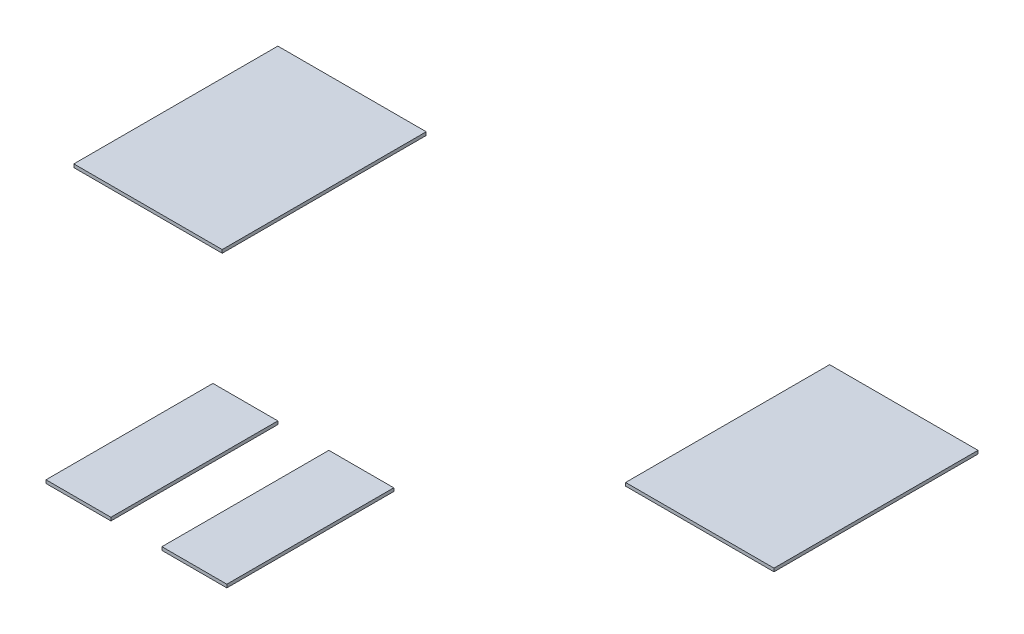
ISO-10303-21;
HEADER;
FILE_DESCRIPTION(('STEP AP214'),'2;1');
FILE_NAME('part.step','',(''),(''),'','','');
FILE_SCHEMA(('AUTOMOTIVE_DESIGN { 1 0 10303 214 1 1 1 1 }'));
ENDSEC;
DATA;
#1=APPLICATION_CONTEXT('core data for automotive mechanical design processes');
#2=APPLICATION_PROTOCOL_DEFINITION('international standard','automotive_design',2000,#1);
#3=PRODUCT_CONTEXT('',#1,'mechanical');
#4=PRODUCT('Part','Part','',(#3));
#5=PRODUCT_RELATED_PRODUCT_CATEGORY('part','',(#4));
#6=PRODUCT_DEFINITION_FORMATION('','',#4);
#7=PRODUCT_DEFINITION_CONTEXT('part definition',#1,'design');
#8=PRODUCT_DEFINITION('design','',#6,#7);
#9=PRODUCT_DEFINITION_SHAPE('','',#8);
#10=(LENGTH_UNIT() NAMED_UNIT(*) SI_UNIT(.MILLI.,.METRE.));
#11=(NAMED_UNIT(*) PLANE_ANGLE_UNIT() SI_UNIT($,.RADIAN.));
#12=(NAMED_UNIT(*) SI_UNIT($,.STERADIAN.) SOLID_ANGLE_UNIT());
#13=UNCERTAINTY_MEASURE_WITH_UNIT(LENGTH_MEASURE(1.E-05),#10,'distance_accuracy_value','');
#14=(GEOMETRIC_REPRESENTATION_CONTEXT(3) GLOBAL_UNCERTAINTY_ASSIGNED_CONTEXT((#13)) GLOBAL_UNIT_ASSIGNED_CONTEXT((#10,
#11,#12)) REPRESENTATION_CONTEXT('',''));
#15=CARTESIAN_POINT('',(0.,0.,0.));
#16=DIRECTION('',(0.,0.,1.));
#17=DIRECTION('',(1.,0.,0.));
#18=AXIS2_PLACEMENT_3D('',#15,#16,#17);
#19=CARTESIAN_POINT('',(-2.175,0.035,-5.3));
#20=DIRECTION('',(-1.,0.,0.));
#21=DIRECTION('',(0.,0.,1.));
#22=AXIS2_PLACEMENT_3D('',#19,#20,#21);
#23=PLANE('',#22);
#24=DIRECTION('',(0.,0.,-1.));
#25=VECTOR('',#24,1.);
#26=CARTESIAN_POINT('',(-2.175,0.,-5.3));
#27=LINE('',#26,#25);
#28=CARTESIAN_POINT('',(-2.175,0.,-3.1));
#29=VERTEX_POINT('',#28);
#30=CARTESIAN_POINT('',(-2.175,0.,-5.3));
#31=VERTEX_POINT('',#30);
#32=EDGE_CURVE('E106',#29,#31,#27,.T.);
#33=ORIENTED_EDGE('',*,*,#32,.T.);
#34=DIRECTION('',(0.,-1.,0.));
#35=VECTOR('',#34,1.);
#36=CARTESIAN_POINT('',(-2.175,0.035,-5.3));
#37=LINE('',#36,#35);
#38=CARTESIAN_POINT('',(-2.175,0.035,-5.3));
#39=VERTEX_POINT('',#38);
#40=EDGE_CURVE('E12',#39,#31,#37,.T.);
#41=ORIENTED_EDGE('',*,*,#40,.F.);
#42=DIRECTION('',(0.,0.,-1.));
#43=VECTOR('',#42,1.);
#44=CARTESIAN_POINT('',(-2.175,0.035,-5.3));
#45=LINE('',#44,#43);
#46=CARTESIAN_POINT('',(-2.175,0.035,-3.1));
#47=VERTEX_POINT('',#46);
#48=EDGE_CURVE('E94',#47,#39,#45,.T.);
#49=ORIENTED_EDGE('',*,*,#48,.F.);
#50=DIRECTION('',(0.,-1.,0.));
#51=VECTOR('',#50,1.);
#52=CARTESIAN_POINT('',(-2.175,0.035,-3.1));
#53=LINE('',#52,#51);
#54=EDGE_CURVE('E102',#47,#29,#53,.T.);
#55=ORIENTED_EDGE('',*,*,#54,.T.);
#56=EDGE_LOOP('',(#33,#41,#49,#55));
#57=FACE_BOUND('',#56,.T.);
#58=ADVANCED_FACE('F43',(#57),#23,.F.);
#59=CARTESIAN_POINT('',(-2.175,0.035,-5.3));
#60=DIRECTION('',(0.,0.,1.));
#61=DIRECTION('',(1.,0.,0.));
#62=AXIS2_PLACEMENT_3D('',#59,#60,#61);
#63=PLANE('',#62);
#64=DIRECTION('',(-1.,0.,0.));
#65=VECTOR('',#64,1.);
#66=CARTESIAN_POINT('',(-2.175,0.,-5.3));
#67=LINE('',#66,#65);
#68=CARTESIAN_POINT('',(-3.775,0.,-5.3));
#69=VERTEX_POINT('',#68);
#70=EDGE_CURVE('E98',#31,#69,#67,.T.);
#71=ORIENTED_EDGE('',*,*,#70,.T.);
#72=DIRECTION('',(0.,-1.,0.));
#73=VECTOR('',#72,1.);
#74=CARTESIAN_POINT('',(-3.775,0.035,-5.3));
#75=LINE('',#74,#73);
#76=CARTESIAN_POINT('',(-3.775,0.035,-5.3));
#77=VERTEX_POINT('',#76);
#78=EDGE_CURVE('E51',#77,#69,#75,.T.);
#79=ORIENTED_EDGE('',*,*,#78,.F.);
#80=DIRECTION('',(-1.,0.,0.));
#81=VECTOR('',#80,1.);
#82=CARTESIAN_POINT('',(-2.175,0.035,-5.3));
#83=LINE('',#82,#81);
#84=EDGE_CURVE('E89',#39,#77,#83,.T.);
#85=ORIENTED_EDGE('',*,*,#84,.F.);
#86=ORIENTED_EDGE('',*,*,#40,.T.);
#87=EDGE_LOOP('',(#71,#79,#85,#86));
#88=FACE_BOUND('',#87,.T.);
#89=ADVANCED_FACE('F97',(#88),#63,.F.);
#90=CARTESIAN_POINT('',(-3.775,0.035,-5.3));
#91=DIRECTION('',(1.,0.,0.));
#92=DIRECTION('',(0.,0.,-1.));
#93=AXIS2_PLACEMENT_3D('',#90,#91,#92);
#94=PLANE('',#93);
#95=DIRECTION('',(0.,0.,1.));
#96=VECTOR('',#95,1.);
#97=CARTESIAN_POINT('',(-3.775,0.,-5.3));
#98=LINE('',#97,#96);
#99=CARTESIAN_POINT('',(-3.775,0.,-3.1));
#100=VERTEX_POINT('',#99);
#101=EDGE_CURVE('E76',#69,#100,#98,.T.);
#102=ORIENTED_EDGE('',*,*,#101,.T.);
#103=DIRECTION('',(0.,-1.,0.));
#104=VECTOR('',#103,1.);
#105=CARTESIAN_POINT('',(-3.775,0.035,-3.1));
#106=LINE('',#105,#104);
#107=CARTESIAN_POINT('',(-3.775,0.035,-3.1));
#108=VERTEX_POINT('',#107);
#109=EDGE_CURVE('E99',#108,#100,#106,.T.);
#110=ORIENTED_EDGE('',*,*,#109,.F.);
#111=DIRECTION('',(0.,0.,1.));
#112=VECTOR('',#111,1.);
#113=CARTESIAN_POINT('',(-3.775,0.035,-5.3));
#114=LINE('',#113,#112);
#115=EDGE_CURVE('E92',#77,#108,#114,.T.);
#116=ORIENTED_EDGE('',*,*,#115,.F.);
#117=ORIENTED_EDGE('',*,*,#78,.T.);
#118=EDGE_LOOP('',(#102,#110,#116,#117));
#119=FACE_BOUND('',#118,.T.);
#120=ADVANCED_FACE('F100',(#119),#94,.F.);
#121=CARTESIAN_POINT('',(-2.175,0.035,-3.1));
#122=DIRECTION('',(0.,0.,-1.));
#123=DIRECTION('',(-1.,0.,0.));
#124=AXIS2_PLACEMENT_3D('',#121,#122,#123);
#125=PLANE('',#124);
#126=DIRECTION('',(1.,0.,0.));
#127=VECTOR('',#126,1.);
#128=CARTESIAN_POINT('',(-2.175,0.,-3.1));
#129=LINE('',#128,#127);
#130=EDGE_CURVE('E82',#100,#29,#129,.T.);
#131=ORIENTED_EDGE('',*,*,#130,.T.);
#132=ORIENTED_EDGE('',*,*,#54,.F.);
#133=DIRECTION('',(1.,0.,0.));
#134=VECTOR('',#133,1.);
#135=CARTESIAN_POINT('',(-2.175,0.035,-3.1));
#136=LINE('',#135,#134);
#137=EDGE_CURVE('E59',#108,#47,#136,.T.);
#138=ORIENTED_EDGE('',*,*,#137,.F.);
#139=ORIENTED_EDGE('',*,*,#109,.T.);
#140=EDGE_LOOP('',(#131,#132,#138,#139));
#141=FACE_BOUND('',#140,.T.);
#142=ADVANCED_FACE('F113',(#141),#125,.F.);
#143=CARTESIAN_POINT('',(0.,0.035,0.));
#144=DIRECTION('',(0.,-1.,0.));
#145=DIRECTION('',(0.,0.,-1.));
#146=AXIS2_PLACEMENT_3D('',#143,#144,#145);
#147=PLANE('',#146);
#148=ORIENTED_EDGE('',*,*,#48,.T.);
#149=ORIENTED_EDGE('',*,*,#84,.T.);
#150=ORIENTED_EDGE('',*,*,#115,.T.);
#151=ORIENTED_EDGE('',*,*,#137,.T.);
#152=EDGE_LOOP('',(#148,#149,#150,#151));
#153=FACE_BOUND('',#152,.T.);
#154=ADVANCED_FACE('F90',(#153),#147,.F.);
#155=CARTESIAN_POINT('',(0.,0.,0.));
#156=DIRECTION('',(0.,-1.,0.));
#157=DIRECTION('',(0.,0.,-1.));
#158=AXIS2_PLACEMENT_3D('',#155,#156,#157);
#159=PLANE('',#158);
#160=ORIENTED_EDGE('',*,*,#32,.F.);
#161=ORIENTED_EDGE('',*,*,#130,.F.);
#162=ORIENTED_EDGE('',*,*,#101,.F.);
#163=ORIENTED_EDGE('',*,*,#70,.F.);
#164=EDGE_LOOP('',(#160,#161,#162,#163));
#165=FACE_BOUND('',#164,.T.);
#166=ADVANCED_FACE('F116',(#165),#159,.T.);
#167=CLOSED_SHELL('',(#58,#89,#120,#142,#154,#166));
#168=MANIFOLD_SOLID_BREP('B2',#167);
#169=CARTESIAN_POINT('',(-0.275,0.035,0.));
#170=DIRECTION('',(-1.,0.,0.));
#171=DIRECTION('',(0.,0.,1.));
#172=AXIS2_PLACEMENT_3D('',#169,#170,#171);
#173=PLANE('',#172);
#174=DIRECTION('',(0.,0.,-1.));
#175=VECTOR('',#174,1.);
#176=CARTESIAN_POINT('',(-0.275,0.,0.));
#177=LINE('',#176,#175);
#178=CARTESIAN_POINT('',(-0.275,0.,0.));
#179=VERTEX_POINT('',#178);
#180=CARTESIAN_POINT('',(-0.275,0.,-1.8));
#181=VERTEX_POINT('',#180);
#182=EDGE_CURVE('E239',#179,#181,#177,.T.);
#183=ORIENTED_EDGE('',*,*,#182,.T.);
#184=DIRECTION('',(0.,-1.,0.));
#185=VECTOR('',#184,1.);
#186=CARTESIAN_POINT('',(-0.275,0.035,-1.8));
#187=LINE('',#186,#185);
#188=CARTESIAN_POINT('',(-0.275,0.035,-1.8));
#189=VERTEX_POINT('',#188);
#190=EDGE_CURVE('E41',#189,#181,#187,.T.);
#191=ORIENTED_EDGE('',*,*,#190,.F.);
#192=DIRECTION('',(0.,0.,-1.));
#193=VECTOR('',#192,1.);
#194=CARTESIAN_POINT('',(-0.275,0.035,0.));
#195=LINE('',#194,#193);
#196=CARTESIAN_POINT('',(-0.275,0.035,0.));
#197=VERTEX_POINT('',#196);
#198=EDGE_CURVE('E227',#197,#189,#195,.T.);
#199=ORIENTED_EDGE('',*,*,#198,.F.);
#200=DIRECTION('',(0.,-1.,0.));
#201=VECTOR('',#200,1.);
#202=CARTESIAN_POINT('',(-0.275,0.035,0.));
#203=LINE('',#202,#201);
#204=EDGE_CURVE('E235',#197,#179,#203,.T.);
#205=ORIENTED_EDGE('',*,*,#204,.T.);
#206=EDGE_LOOP('',(#183,#191,#199,#205));
#207=FACE_BOUND('',#206,.T.);
#208=ADVANCED_FACE('F176',(#207),#173,.F.);
#209=CARTESIAN_POINT('',(-0.275,0.035,-1.8));
#210=DIRECTION('',(0.,0.,1.));
#211=DIRECTION('',(1.,0.,0.));
#212=AXIS2_PLACEMENT_3D('',#209,#210,#211);
#213=PLANE('',#212);
#214=DIRECTION('',(-1.,0.,0.));
#215=VECTOR('',#214,1.);
#216=CARTESIAN_POINT('',(-0.275,0.,-1.8));
#217=LINE('',#216,#215);
#218=CARTESIAN_POINT('',(-0.974999999999999,0.,-1.8));
#219=VERTEX_POINT('',#218);
#220=EDGE_CURVE('E231',#181,#219,#217,.T.);
#221=ORIENTED_EDGE('',*,*,#220,.T.);
#222=DIRECTION('',(0.,-1.,0.));
#223=VECTOR('',#222,1.);
#224=CARTESIAN_POINT('',(-0.974999999999999,0.035,-1.8));
#225=LINE('',#224,#223);
#226=CARTESIAN_POINT('',(-0.974999999999999,0.035,-1.8));
#227=VERTEX_POINT('',#226);
#228=EDGE_CURVE('E184',#227,#219,#225,.T.);
#229=ORIENTED_EDGE('',*,*,#228,.F.);
#230=DIRECTION('',(-1.,0.,0.));
#231=VECTOR('',#230,1.);
#232=CARTESIAN_POINT('',(-0.275,0.035,-1.8));
#233=LINE('',#232,#231);
#234=EDGE_CURVE('E222',#189,#227,#233,.T.);
#235=ORIENTED_EDGE('',*,*,#234,.F.);
#236=ORIENTED_EDGE('',*,*,#190,.T.);
#237=EDGE_LOOP('',(#221,#229,#235,#236));
#238=FACE_BOUND('',#237,.T.);
#239=ADVANCED_FACE('F230',(#238),#213,.F.);
#240=CARTESIAN_POINT('',(-0.975,0.035,0.));
#241=DIRECTION('',(1.,0.,0.));
#242=DIRECTION('',(0.,0.,-1.));
#243=AXIS2_PLACEMENT_3D('',#240,#241,#242);
#244=PLANE('',#243);
#245=DIRECTION('',(0.,0.,1.));
#246=VECTOR('',#245,1.);
#247=CARTESIAN_POINT('',(-0.975,0.,0.));
#248=LINE('',#247,#246);
#249=CARTESIAN_POINT('',(-0.975,0.,0.));
#250=VERTEX_POINT('',#249);
#251=EDGE_CURVE('E209',#219,#250,#248,.T.);
#252=ORIENTED_EDGE('',*,*,#251,.T.);
#253=DIRECTION('',(0.,-1.,0.));
#254=VECTOR('',#253,1.);
#255=CARTESIAN_POINT('',(-0.975,0.035,0.));
#256=LINE('',#255,#254);
#257=CARTESIAN_POINT('',(-0.975,0.035,0.));
#258=VERTEX_POINT('',#257);
#259=EDGE_CURVE('E232',#258,#250,#256,.T.);
#260=ORIENTED_EDGE('',*,*,#259,.F.);
#261=DIRECTION('',(0.,0.,1.));
#262=VECTOR('',#261,1.);
#263=CARTESIAN_POINT('',(-0.975,0.035,0.));
#264=LINE('',#263,#262);
#265=EDGE_CURVE('E225',#227,#258,#264,.T.);
#266=ORIENTED_EDGE('',*,*,#265,.F.);
#267=ORIENTED_EDGE('',*,*,#228,.T.);
#268=EDGE_LOOP('',(#252,#260,#266,#267));
#269=FACE_BOUND('',#268,.T.);
#270=ADVANCED_FACE('F233',(#269),#244,.F.);
#271=CARTESIAN_POINT('',(-0.275,0.035,0.));
#272=DIRECTION('',(0.,0.,-1.));
#273=DIRECTION('',(-1.,0.,0.));
#274=AXIS2_PLACEMENT_3D('',#271,#272,#273);
#275=PLANE('',#274);
#276=DIRECTION('',(1.,0.,0.));
#277=VECTOR('',#276,1.);
#278=CARTESIAN_POINT('',(-0.275,0.,0.));
#279=LINE('',#278,#277);
#280=EDGE_CURVE('E215',#250,#179,#279,.T.);
#281=ORIENTED_EDGE('',*,*,#280,.T.);
#282=ORIENTED_EDGE('',*,*,#204,.F.);
#283=DIRECTION('',(1.,0.,0.));
#284=VECTOR('',#283,1.);
#285=CARTESIAN_POINT('',(-0.275,0.035,0.));
#286=LINE('',#285,#284);
#287=EDGE_CURVE('E192',#258,#197,#286,.T.);
#288=ORIENTED_EDGE('',*,*,#287,.F.);
#289=ORIENTED_EDGE('',*,*,#259,.T.);
#290=EDGE_LOOP('',(#281,#282,#288,#289));
#291=FACE_BOUND('',#290,.T.);
#292=ADVANCED_FACE('F246',(#291),#275,.F.);
#293=CARTESIAN_POINT('',(0.,0.035,0.));
#294=DIRECTION('',(0.,1.,0.));
#295=DIRECTION('',(0.,0.,1.));
#296=AXIS2_PLACEMENT_3D('',#293,#294,#295);
#297=PLANE('',#296);
#298=ORIENTED_EDGE('',*,*,#198,.T.);
#299=ORIENTED_EDGE('',*,*,#234,.T.);
#300=ORIENTED_EDGE('',*,*,#265,.T.);
#301=ORIENTED_EDGE('',*,*,#287,.T.);
#302=EDGE_LOOP('',(#298,#299,#300,#301));
#303=FACE_BOUND('',#302,.T.);
#304=ADVANCED_FACE('F223',(#303),#297,.T.);
#305=CARTESIAN_POINT('',(0.,0.,0.));
#306=DIRECTION('',(0.,1.,0.));
#307=DIRECTION('',(0.,0.,1.));
#308=AXIS2_PLACEMENT_3D('',#305,#306,#307);
#309=PLANE('',#308);
#310=ORIENTED_EDGE('',*,*,#182,.F.);
#311=ORIENTED_EDGE('',*,*,#280,.F.);
#312=ORIENTED_EDGE('',*,*,#251,.F.);
#313=ORIENTED_EDGE('',*,*,#220,.F.);
#314=EDGE_LOOP('',(#310,#311,#312,#313));
#315=FACE_BOUND('',#314,.T.);
#316=ADVANCED_FACE('F249',(#315),#309,.F.);
#317=CLOSED_SHELL('',(#208,#239,#270,#292,#304,#316));
#318=MANIFOLD_SOLID_BREP('B6',#317);
#319=CARTESIAN_POINT('',(2.175,0.035,-5.3));
#320=DIRECTION('',(1.,0.,0.));
#321=DIRECTION('',(0.,0.,-1.));
#322=AXIS2_PLACEMENT_3D('',#319,#320,#321);
#323=PLANE('',#322);
#324=DIRECTION('',(0.,0.,1.));
#325=VECTOR('',#324,1.);
#326=CARTESIAN_POINT('',(2.175,0.,-5.3));
#327=LINE('',#326,#325);
#328=CARTESIAN_POINT('',(2.175,0.,-5.3));
#329=VERTEX_POINT('',#328);
#330=CARTESIAN_POINT('',(2.175,0.,-3.1));
#331=VERTEX_POINT('',#330);
#332=EDGE_CURVE('E371',#329,#331,#327,.T.);
#333=ORIENTED_EDGE('',*,*,#332,.T.);
#334=DIRECTION('',(0.,-1.,0.));
#335=VECTOR('',#334,1.);
#336=CARTESIAN_POINT('',(2.175,0.035,-3.1));
#337=LINE('',#336,#335);
#338=CARTESIAN_POINT('',(2.175,0.035,-3.1));
#339=VERTEX_POINT('',#338);
#340=EDGE_CURVE('E174',#339,#331,#337,.T.);
#341=ORIENTED_EDGE('',*,*,#340,.F.);
#342=DIRECTION('',(0.,0.,1.));
#343=VECTOR('',#342,1.);
#344=CARTESIAN_POINT('',(2.175,0.035,-5.3));
#345=LINE('',#344,#343);
#346=CARTESIAN_POINT('',(2.175,0.035,-5.3));
#347=VERTEX_POINT('',#346);
#348=EDGE_CURVE('E359',#347,#339,#345,.T.);
#349=ORIENTED_EDGE('',*,*,#348,.F.);
#350=DIRECTION('',(0.,-1.,0.));
#351=VECTOR('',#350,1.);
#352=CARTESIAN_POINT('',(2.175,0.035,-5.3));
#353=LINE('',#352,#351);
#354=EDGE_CURVE('E367',#347,#329,#353,.T.);
#355=ORIENTED_EDGE('',*,*,#354,.T.);
#356=EDGE_LOOP('',(#333,#341,#349,#355));
#357=FACE_BOUND('',#356,.T.);
#358=ADVANCED_FACE('F308',(#357),#323,.F.);
#359=CARTESIAN_POINT('',(2.175,0.035,-3.1));
#360=DIRECTION('',(0.,0.,-1.));
#361=DIRECTION('',(-1.,0.,0.));
#362=AXIS2_PLACEMENT_3D('',#359,#360,#361);
#363=PLANE('',#362);
#364=DIRECTION('',(1.,0.,0.));
#365=VECTOR('',#364,1.);
#366=CARTESIAN_POINT('',(2.175,0.,-3.1));
#367=LINE('',#366,#365);
#368=CARTESIAN_POINT('',(3.775,0.,-3.1));
#369=VERTEX_POINT('',#368);
#370=EDGE_CURVE('E363',#331,#369,#367,.T.);
#371=ORIENTED_EDGE('',*,*,#370,.T.);
#372=DIRECTION('',(0.,-1.,0.));
#373=VECTOR('',#372,1.);
#374=CARTESIAN_POINT('',(3.775,0.035,-3.1));
#375=LINE('',#374,#373);
#376=CARTESIAN_POINT('',(3.775,0.035,-3.1));
#377=VERTEX_POINT('',#376);
#378=EDGE_CURVE('E316',#377,#369,#375,.T.);
#379=ORIENTED_EDGE('',*,*,#378,.F.);
#380=DIRECTION('',(1.,0.,0.));
#381=VECTOR('',#380,1.);
#382=CARTESIAN_POINT('',(2.175,0.035,-3.1));
#383=LINE('',#382,#381);
#384=EDGE_CURVE('E354',#339,#377,#383,.T.);
#385=ORIENTED_EDGE('',*,*,#384,.F.);
#386=ORIENTED_EDGE('',*,*,#340,.T.);
#387=EDGE_LOOP('',(#371,#379,#385,#386));
#388=FACE_BOUND('',#387,.T.);
#389=ADVANCED_FACE('F362',(#388),#363,.F.);
#390=CARTESIAN_POINT('',(3.775,0.035,-5.3));
#391=DIRECTION('',(-1.,0.,0.));
#392=DIRECTION('',(0.,0.,1.));
#393=AXIS2_PLACEMENT_3D('',#390,#391,#392);
#394=PLANE('',#393);
#395=DIRECTION('',(0.,0.,-1.));
#396=VECTOR('',#395,1.);
#397=CARTESIAN_POINT('',(3.775,0.,-5.3));
#398=LINE('',#397,#396);
#399=CARTESIAN_POINT('',(3.775,0.,-5.3));
#400=VERTEX_POINT('',#399);
#401=EDGE_CURVE('E341',#369,#400,#398,.T.);
#402=ORIENTED_EDGE('',*,*,#401,.T.);
#403=DIRECTION('',(0.,-1.,0.));
#404=VECTOR('',#403,1.);
#405=CARTESIAN_POINT('',(3.775,0.035,-5.3));
#406=LINE('',#405,#404);
#407=CARTESIAN_POINT('',(3.775,0.035,-5.3));
#408=VERTEX_POINT('',#407);
#409=EDGE_CURVE('E364',#408,#400,#406,.T.);
#410=ORIENTED_EDGE('',*,*,#409,.F.);
#411=DIRECTION('',(0.,0.,-1.));
#412=VECTOR('',#411,1.);
#413=CARTESIAN_POINT('',(3.775,0.035,-5.3));
#414=LINE('',#413,#412);
#415=EDGE_CURVE('E357',#377,#408,#414,.T.);
#416=ORIENTED_EDGE('',*,*,#415,.F.);
#417=ORIENTED_EDGE('',*,*,#378,.T.);
#418=EDGE_LOOP('',(#402,#410,#416,#417));
#419=FACE_BOUND('',#418,.T.);
#420=ADVANCED_FACE('F365',(#419),#394,.F.);
#421=CARTESIAN_POINT('',(2.175,0.035,-5.3));
#422=DIRECTION('',(0.,0.,1.));
#423=DIRECTION('',(1.,0.,0.));
#424=AXIS2_PLACEMENT_3D('',#421,#422,#423);
#425=PLANE('',#424);
#426=DIRECTION('',(-1.,0.,0.));
#427=VECTOR('',#426,1.);
#428=CARTESIAN_POINT('',(2.175,0.,-5.3));
#429=LINE('',#428,#427);
#430=EDGE_CURVE('E347',#400,#329,#429,.T.);
#431=ORIENTED_EDGE('',*,*,#430,.T.);
#432=ORIENTED_EDGE('',*,*,#354,.F.);
#433=DIRECTION('',(-1.,0.,0.));
#434=VECTOR('',#433,1.);
#435=CARTESIAN_POINT('',(2.175,0.035,-5.3));
#436=LINE('',#435,#434);
#437=EDGE_CURVE('E324',#408,#347,#436,.T.);
#438=ORIENTED_EDGE('',*,*,#437,.F.);
#439=ORIENTED_EDGE('',*,*,#409,.T.);
#440=EDGE_LOOP('',(#431,#432,#438,#439));
#441=FACE_BOUND('',#440,.T.);
#442=ADVANCED_FACE('F378',(#441),#425,.F.);
#443=CARTESIAN_POINT('',(0.,0.035,0.));
#444=DIRECTION('',(0.,1.,0.));
#445=DIRECTION('',(0.,0.,1.));
#446=AXIS2_PLACEMENT_3D('',#443,#444,#445);
#447=PLANE('',#446);
#448=ORIENTED_EDGE('',*,*,#348,.T.);
#449=ORIENTED_EDGE('',*,*,#384,.T.);
#450=ORIENTED_EDGE('',*,*,#415,.T.);
#451=ORIENTED_EDGE('',*,*,#437,.T.);
#452=EDGE_LOOP('',(#448,#449,#450,#451));
#453=FACE_BOUND('',#452,.T.);
#454=ADVANCED_FACE('F355',(#453),#447,.T.);
#455=CARTESIAN_POINT('',(0.,0.,0.));
#456=DIRECTION('',(0.,1.,0.));
#457=DIRECTION('',(0.,0.,1.));
#458=AXIS2_PLACEMENT_3D('',#455,#456,#457);
#459=PLANE('',#458);
#460=ORIENTED_EDGE('',*,*,#332,.F.);
#461=ORIENTED_EDGE('',*,*,#430,.F.);
#462=ORIENTED_EDGE('',*,*,#401,.F.);
#463=ORIENTED_EDGE('',*,*,#370,.F.);
#464=EDGE_LOOP('',(#460,#461,#462,#463));
#465=FACE_BOUND('',#464,.T.);
#466=ADVANCED_FACE('F381',(#465),#459,.F.);
#467=CLOSED_SHELL('',(#358,#389,#420,#442,#454,#466));
#468=MANIFOLD_SOLID_BREP('B35',#467);
#469=CARTESIAN_POINT('',(0.275,0.035,0.));
#470=DIRECTION('',(1.,0.,0.));
#471=DIRECTION('',(0.,0.,-1.));
#472=AXIS2_PLACEMENT_3D('',#469,#470,#471);
#473=PLANE('',#472);
#474=DIRECTION('',(0.,0.,1.));
#475=VECTOR('',#474,1.);
#476=CARTESIAN_POINT('',(0.275,0.,0.));
#477=LINE('',#476,#475);
#478=CARTESIAN_POINT('',(0.275,0.,-1.8));
#479=VERTEX_POINT('',#478);
#480=CARTESIAN_POINT('',(0.275,0.,0.));
#481=VERTEX_POINT('',#480);
#482=EDGE_CURVE('E494',#479,#481,#477,.T.);
#483=ORIENTED_EDGE('',*,*,#482,.T.);
#484=DIRECTION('',(0.,-1.,0.));
#485=VECTOR('',#484,1.);
#486=CARTESIAN_POINT('',(0.275,0.035,0.));
#487=LINE('',#486,#485);
#488=CARTESIAN_POINT('',(0.275,0.035,0.));
#489=VERTEX_POINT('',#488);
#490=EDGE_CURVE('E306',#489,#481,#487,.T.);
#491=ORIENTED_EDGE('',*,*,#490,.F.);
#492=DIRECTION('',(0.,0.,1.));
#493=VECTOR('',#492,1.);
#494=CARTESIAN_POINT('',(0.275,0.035,0.));
#495=LINE('',#494,#493);
#496=CARTESIAN_POINT('',(0.275,0.035,-1.8));
#497=VERTEX_POINT('',#496);
#498=EDGE_CURVE('E482',#497,#489,#495,.T.);
#499=ORIENTED_EDGE('',*,*,#498,.F.);
#500=DIRECTION('',(0.,-1.,0.));
#501=VECTOR('',#500,1.);
#502=CARTESIAN_POINT('',(0.275,0.035,-1.8));
#503=LINE('',#502,#501);
#504=EDGE_CURVE('E490',#497,#479,#503,.T.);
#505=ORIENTED_EDGE('',*,*,#504,.T.);
#506=EDGE_LOOP('',(#483,#491,#499,#505));
#507=FACE_BOUND('',#506,.T.);
#508=ADVANCED_FACE('F431',(#507),#473,.F.);
#509=CARTESIAN_POINT('',(0.275,0.035,0.));
#510=DIRECTION('',(0.,0.,-1.));
#511=DIRECTION('',(-1.,0.,0.));
#512=AXIS2_PLACEMENT_3D('',#509,#510,#511);
#513=PLANE('',#512);
#514=DIRECTION('',(1.,0.,0.));
#515=VECTOR('',#514,1.);
#516=CARTESIAN_POINT('',(0.275,0.,0.));
#517=LINE('',#516,#515);
#518=CARTESIAN_POINT('',(0.975,0.,0.));
#519=VERTEX_POINT('',#518);
#520=EDGE_CURVE('E486',#481,#519,#517,.T.);
#521=ORIENTED_EDGE('',*,*,#520,.T.);
#522=DIRECTION('',(0.,-1.,0.));
#523=VECTOR('',#522,1.);
#524=CARTESIAN_POINT('',(0.975,0.035,0.));
#525=LINE('',#524,#523);
#526=CARTESIAN_POINT('',(0.975,0.035,0.));
#527=VERTEX_POINT('',#526);
#528=EDGE_CURVE('E439',#527,#519,#525,.T.);
#529=ORIENTED_EDGE('',*,*,#528,.F.);
#530=DIRECTION('',(1.,0.,0.));
#531=VECTOR('',#530,1.);
#532=CARTESIAN_POINT('',(0.275,0.035,0.));
#533=LINE('',#532,#531);
#534=EDGE_CURVE('E477',#489,#527,#533,.T.);
#535=ORIENTED_EDGE('',*,*,#534,.F.);
#536=ORIENTED_EDGE('',*,*,#490,.T.);
#537=EDGE_LOOP('',(#521,#529,#535,#536));
#538=FACE_BOUND('',#537,.T.);
#539=ADVANCED_FACE('F485',(#538),#513,.F.);
#540=CARTESIAN_POINT('',(0.975,0.035,0.));
#541=DIRECTION('',(-1.,0.,0.));
#542=DIRECTION('',(0.,0.,1.));
#543=AXIS2_PLACEMENT_3D('',#540,#541,#542);
#544=PLANE('',#543);
#545=DIRECTION('',(0.,0.,-1.));
#546=VECTOR('',#545,1.);
#547=CARTESIAN_POINT('',(0.975,0.,0.));
#548=LINE('',#547,#546);
#549=CARTESIAN_POINT('',(0.974999999999999,0.,-1.8));
#550=VERTEX_POINT('',#549);
#551=EDGE_CURVE('E464',#519,#550,#548,.T.);
#552=ORIENTED_EDGE('',*,*,#551,.T.);
#553=DIRECTION('',(0.,-1.,0.));
#554=VECTOR('',#553,1.);
#555=CARTESIAN_POINT('',(0.974999999999999,0.035,-1.8));
#556=LINE('',#555,#554);
#557=CARTESIAN_POINT('',(0.974999999999999,0.035,-1.8));
#558=VERTEX_POINT('',#557);
#559=EDGE_CURVE('E487',#558,#550,#556,.T.);
#560=ORIENTED_EDGE('',*,*,#559,.F.);
#561=DIRECTION('',(0.,0.,-1.));
#562=VECTOR('',#561,1.);
#563=CARTESIAN_POINT('',(0.975,0.035,0.));
#564=LINE('',#563,#562);
#565=EDGE_CURVE('E480',#527,#558,#564,.T.);
#566=ORIENTED_EDGE('',*,*,#565,.F.);
#567=ORIENTED_EDGE('',*,*,#528,.T.);
#568=EDGE_LOOP('',(#552,#560,#566,#567));
#569=FACE_BOUND('',#568,.T.);
#570=ADVANCED_FACE('F488',(#569),#544,.F.);
#571=CARTESIAN_POINT('',(0.275,0.035,-1.8));
#572=DIRECTION('',(0.,0.,1.));
#573=DIRECTION('',(1.,0.,0.));
#574=AXIS2_PLACEMENT_3D('',#571,#572,#573);
#575=PLANE('',#574);
#576=DIRECTION('',(-1.,0.,0.));
#577=VECTOR('',#576,1.);
#578=CARTESIAN_POINT('',(0.275,0.,-1.8));
#579=LINE('',#578,#577);
#580=EDGE_CURVE('E470',#550,#479,#579,.T.);
#581=ORIENTED_EDGE('',*,*,#580,.T.);
#582=ORIENTED_EDGE('',*,*,#504,.F.);
#583=DIRECTION('',(-1.,0.,0.));
#584=VECTOR('',#583,1.);
#585=CARTESIAN_POINT('',(0.275,0.035,-1.8));
#586=LINE('',#585,#584);
#587=EDGE_CURVE('E447',#558,#497,#586,.T.);
#588=ORIENTED_EDGE('',*,*,#587,.F.);
#589=ORIENTED_EDGE('',*,*,#559,.T.);
#590=EDGE_LOOP('',(#581,#582,#588,#589));
#591=FACE_BOUND('',#590,.T.);
#592=ADVANCED_FACE('F501',(#591),#575,.F.);
#593=CARTESIAN_POINT('',(0.,0.035,0.));
#594=DIRECTION('',(0.,-1.,0.));
#595=DIRECTION('',(0.,0.,-1.));
#596=AXIS2_PLACEMENT_3D('',#593,#594,#595);
#597=PLANE('',#596);
#598=ORIENTED_EDGE('',*,*,#498,.T.);
#599=ORIENTED_EDGE('',*,*,#534,.T.);
#600=ORIENTED_EDGE('',*,*,#565,.T.);
#601=ORIENTED_EDGE('',*,*,#587,.T.);
#602=EDGE_LOOP('',(#598,#599,#600,#601));
#603=FACE_BOUND('',#602,.T.);
#604=ADVANCED_FACE('F478',(#603),#597,.F.);
#605=CARTESIAN_POINT('',(0.,0.,0.));
#606=DIRECTION('',(0.,-1.,0.));
#607=DIRECTION('',(0.,0.,-1.));
#608=AXIS2_PLACEMENT_3D('',#605,#606,#607);
#609=PLANE('',#608);
#610=ORIENTED_EDGE('',*,*,#482,.F.);
#611=ORIENTED_EDGE('',*,*,#580,.F.);
#612=ORIENTED_EDGE('',*,*,#551,.F.);
#613=ORIENTED_EDGE('',*,*,#520,.F.);
#614=EDGE_LOOP('',(#610,#611,#612,#613));
#615=FACE_BOUND('',#614,.T.);
#616=ADVANCED_FACE('F504',(#615),#609,.T.);
#617=CLOSED_SHELL('',(#508,#539,#570,#592,#604,#616));
#618=MANIFOLD_SOLID_BREP('B168',#617);
#619=ADVANCED_BREP_SHAPE_REPRESENTATION('',(#18,#168,#318,#468,#618),#14);
#620=SHAPE_DEFINITION_REPRESENTATION(#9,#619);
ENDSEC;
END-ISO-10303-21;
